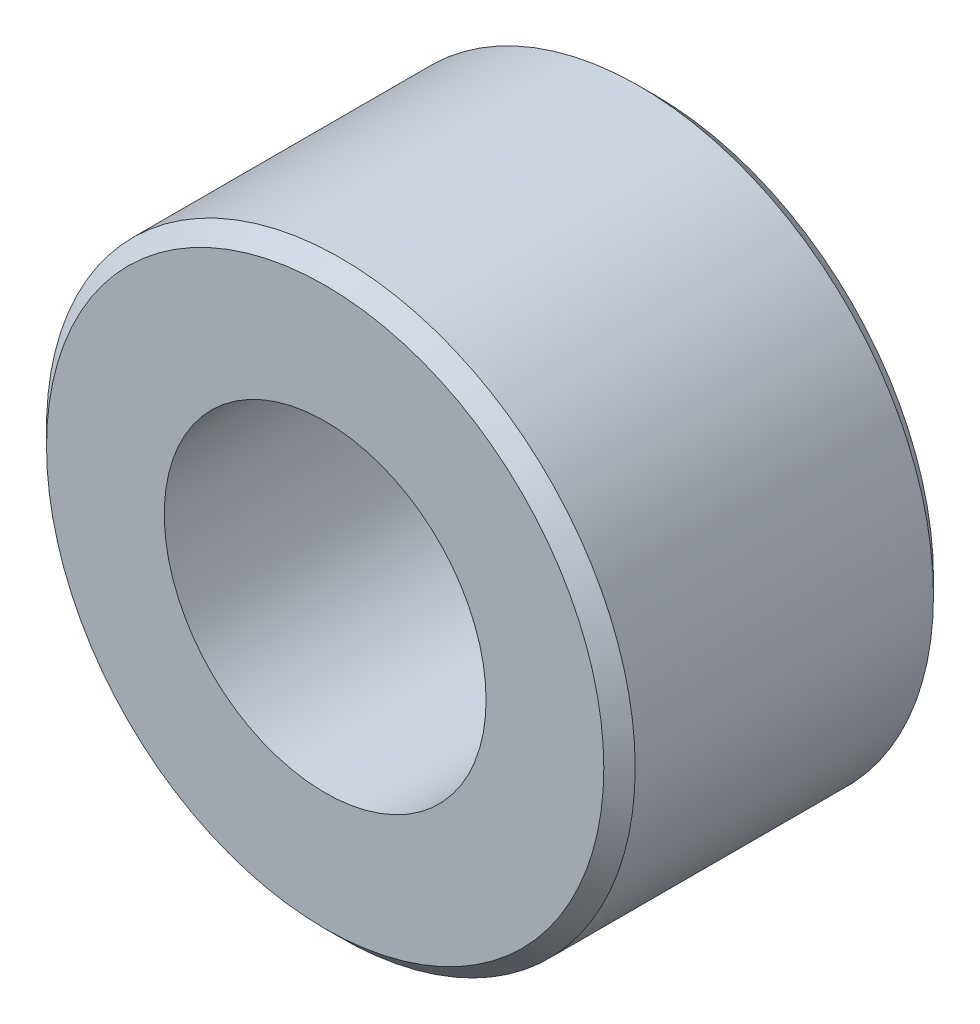
ISO-10303-21;
HEADER;
FILE_DESCRIPTION(('STEP AP214'),'2;1');
FILE_NAME('part.step','',(''),(''),'','','');
FILE_SCHEMA(('AUTOMOTIVE_DESIGN { 1 0 10303 214 1 1 1 1 }'));
ENDSEC;
DATA;
#1=APPLICATION_CONTEXT('core data for automotive mechanical design processes');
#2=APPLICATION_PROTOCOL_DEFINITION('international standard','automotive_design',2000,#1);
#3=PRODUCT_CONTEXT('',#1,'mechanical');
#4=PRODUCT('Part','Part','',(#3));
#5=PRODUCT_RELATED_PRODUCT_CATEGORY('part','',(#4));
#6=PRODUCT_DEFINITION_FORMATION('','',#4);
#7=PRODUCT_DEFINITION_CONTEXT('part definition',#1,'design');
#8=PRODUCT_DEFINITION('design','',#6,#7);
#9=PRODUCT_DEFINITION_SHAPE('','',#8);
#10=(LENGTH_UNIT() NAMED_UNIT(*) SI_UNIT(.MILLI.,.METRE.));
#11=(NAMED_UNIT(*) PLANE_ANGLE_UNIT() SI_UNIT($,.RADIAN.));
#12=(NAMED_UNIT(*) SI_UNIT($,.STERADIAN.) SOLID_ANGLE_UNIT());
#13=UNCERTAINTY_MEASURE_WITH_UNIT(LENGTH_MEASURE(1.E-05),#10,'distance_accuracy_value','');
#14=(GEOMETRIC_REPRESENTATION_CONTEXT(3) GLOBAL_UNCERTAINTY_ASSIGNED_CONTEXT((#13)) GLOBAL_UNIT_ASSIGNED_CONTEXT((#10,
#11,#12)) REPRESENTATION_CONTEXT('',''));
#15=CARTESIAN_POINT('',(0.,0.,0.));
#16=DIRECTION('',(0.,0.,1.));
#17=DIRECTION('',(1.,0.,0.));
#18=AXIS2_PLACEMENT_3D('',#15,#16,#17);
#19=CARTESIAN_POINT('',(0.,0.,4.2));
#20=DIRECTION('',(0.,0.,1.));
#21=DIRECTION('',(1.,0.,0.));
#22=AXIS2_PLACEMENT_3D('',#19,#20,#21);
#23=PLANE('',#22);
#24=CARTESIAN_POINT('',(0.,0.,4.2));
#25=DIRECTION('',(0.,0.,1.));
#26=DIRECTION('',(1.,0.,0.));
#27=AXIS2_PLACEMENT_3D('',#24,#25,#26);
#28=CIRCLE('',#27,7.1);
#29=CARTESIAN_POINT('',(7.1,0.,4.2));
#30=VERTEX_POINT('',#29);
#31=EDGE_CURVE('E10',#30,#30,#28,.T.);
#32=ORIENTED_EDGE('',*,*,#31,.T.);
#33=EDGE_LOOP('',(#32));
#34=FACE_BOUND('',#33,.T.);
#35=CARTESIAN_POINT('',(0.,0.,4.2));
#36=DIRECTION('',(0.,0.,1.));
#37=DIRECTION('',(1.,0.,0.));
#38=AXIS2_PLACEMENT_3D('',#35,#36,#37);
#39=CIRCLE('',#38,4.1);
#40=CARTESIAN_POINT('',(4.1,0.,4.2));
#41=VERTEX_POINT('',#40);
#42=EDGE_CURVE('E68',#41,#41,#39,.T.);
#43=ORIENTED_EDGE('',*,*,#42,.F.);
#44=EDGE_LOOP('',(#43));
#45=FACE_BOUND('',#44,.T.);
#46=ADVANCED_FACE('F42',(#34,#45),#23,.T.);
#47=CARTESIAN_POINT('',(0.,0.,-4.2));
#48=DIRECTION('',(0.,0.,1.));
#49=DIRECTION('',(1.,0.,0.));
#50=AXIS2_PLACEMENT_3D('',#47,#48,#49);
#51=PLANE('',#50);
#52=CARTESIAN_POINT('',(0.,0.,-4.2));
#53=DIRECTION('',(0.,0.,1.));
#54=DIRECTION('',(1.,0.,0.));
#55=AXIS2_PLACEMENT_3D('',#52,#53,#54);
#56=CIRCLE('',#55,7.1);
#57=CARTESIAN_POINT('',(7.1,0.,-4.2));
#58=VERTEX_POINT('',#57);
#59=EDGE_CURVE('E51',#58,#58,#56,.F.);
#60=ORIENTED_EDGE('',*,*,#59,.T.);
#61=EDGE_LOOP('',(#60));
#62=FACE_BOUND('',#61,.T.);
#63=CARTESIAN_POINT('',(0.,0.,-4.2));
#64=DIRECTION('',(0.,0.,1.));
#65=DIRECTION('',(1.,0.,0.));
#66=AXIS2_PLACEMENT_3D('',#63,#64,#65);
#67=CIRCLE('',#66,4.1);
#68=CARTESIAN_POINT('',(4.1,0.,-4.2));
#69=VERTEX_POINT('',#68);
#70=EDGE_CURVE('E69',#69,#69,#67,.T.);
#71=ORIENTED_EDGE('',*,*,#70,.T.);
#72=EDGE_LOOP('',(#71));
#73=FACE_BOUND('',#72,.T.);
#74=ADVANCED_FACE('F80',(#62,#73),#51,.F.);
#75=CARTESIAN_POINT('',(0.,0.,4.2));
#76=DIRECTION('',(0.,0.,-1.));
#77=DIRECTION('',(-1.,0.,0.));
#78=AXIS2_PLACEMENT_3D('',#75,#76,#77);
#79=CYLINDRICAL_SURFACE('',#78,7.5);
#80=CARTESIAN_POINT('',(0.,0.,-3.8));
#81=DIRECTION('',(0.,0.,1.));
#82=DIRECTION('',(1.,0.,0.));
#83=AXIS2_PLACEMENT_3D('',#80,#81,#82);
#84=CIRCLE('',#83,7.5);
#85=CARTESIAN_POINT('',(7.5,0.,-3.8));
#86=VERTEX_POINT('',#85);
#87=EDGE_CURVE('E56',#86,#86,#84,.T.);
#88=ORIENTED_EDGE('',*,*,#87,.T.);
#89=EDGE_LOOP('',(#88));
#90=FACE_BOUND('',#89,.T.);
#91=CARTESIAN_POINT('',(0.,0.,3.8));
#92=DIRECTION('',(0.,0.,1.));
#93=DIRECTION('',(1.,0.,0.));
#94=AXIS2_PLACEMENT_3D('',#91,#92,#93);
#95=CIRCLE('',#94,7.5);
#96=CARTESIAN_POINT('',(7.5,0.,3.8));
#97=VERTEX_POINT('',#96);
#98=EDGE_CURVE('E62',#97,#97,#95,.F.);
#99=ORIENTED_EDGE('',*,*,#98,.T.);
#100=EDGE_LOOP('',(#99));
#101=FACE_BOUND('',#100,.T.);
#102=ADVANCED_FACE('F85',(#90,#101),#79,.T.);
#103=CARTESIAN_POINT('',(0.,0.,4.2));
#104=DIRECTION('',(0.,0.,-1.));
#105=DIRECTION('',(-1.,0.,0.));
#106=AXIS2_PLACEMENT_3D('',#103,#104,#105);
#107=CYLINDRICAL_SURFACE('',#106,4.1);
#108=ORIENTED_EDGE('',*,*,#42,.T.);
#109=EDGE_LOOP('',(#108));
#110=FACE_BOUND('',#109,.T.);
#111=ORIENTED_EDGE('',*,*,#70,.F.);
#112=EDGE_LOOP('',(#111));
#113=FACE_BOUND('',#112,.T.);
#114=ADVANCED_FACE('F76',(#110,#113),#107,.F.);
#115=CARTESIAN_POINT('',(0.,0.,-3.8));
#116=DIRECTION('',(0.,0.,1.));
#117=DIRECTION('',(1.,0.,0.));
#118=AXIS2_PLACEMENT_3D('',#115,#116,#117);
#119=CONICAL_SURFACE('',#118,7.5,0.78539816339745);
#120=CARTESIAN_POINT('',(7.1,0.,-4.2));
#121=CARTESIAN_POINT('',(7.10416666666667,0.,-4.19583333333333));
#122=CARTESIAN_POINT('',(7.10833333333333,0.,-4.19166666666667));
#123=CARTESIAN_POINT('',(7.11666666666667,0.,-4.18333333333333));
#124=CARTESIAN_POINT('',(7.12083333333333,0.,-4.17916666666667));
#125=CARTESIAN_POINT('',(7.12916666666666,0.,-4.17083333333333));
#126=CARTESIAN_POINT('',(7.13333333333333,0.,-4.16666666666667));
#127=CARTESIAN_POINT('',(7.14166666666666,0.,-4.15833333333333));
#128=CARTESIAN_POINT('',(7.14583333333333,0.,-4.15416666666667));
#129=CARTESIAN_POINT('',(7.15416666666667,0.,-4.14583333333333));
#130=CARTESIAN_POINT('',(7.15833333333333,0.,-4.14166666666667));
#131=CARTESIAN_POINT('',(7.16666666666667,0.,-4.13333333333333));
#132=CARTESIAN_POINT('',(7.17083333333333,0.,-4.12916666666667));
#133=CARTESIAN_POINT('',(7.17916666666666,0.,-4.12083333333333));
#134=CARTESIAN_POINT('',(7.18333333333333,0.,-4.11666666666667));
#135=CARTESIAN_POINT('',(7.19166666666667,0.,-4.10833333333334));
#136=CARTESIAN_POINT('',(7.19583333333333,0.,-4.10416666666667));
#137=CARTESIAN_POINT('',(7.20416666666666,0.,-4.09583333333333));
#138=CARTESIAN_POINT('',(7.20833333333333,0.,-4.09166666666667));
#139=CARTESIAN_POINT('',(7.21666666666667,0.,-4.08333333333333));
#140=CARTESIAN_POINT('',(7.22083333333333,0.,-4.07916666666667));
#141=CARTESIAN_POINT('',(7.22916666666667,0.,-4.07083333333333));
#142=CARTESIAN_POINT('',(7.23333333333333,0.,-4.06666666666667));
#143=CARTESIAN_POINT('',(7.24166666666666,0.,-4.05833333333333));
#144=CARTESIAN_POINT('',(7.24583333333333,0.,-4.05416666666667));
#145=CARTESIAN_POINT('',(7.25416666666667,0.,-4.04583333333333));
#146=CARTESIAN_POINT('',(7.25833333333333,0.,-4.04166666666667));
#147=CARTESIAN_POINT('',(7.26666666666666,0.,-4.03333333333333));
#148=CARTESIAN_POINT('',(7.27083333333333,0.,-4.02916666666667));
#149=CARTESIAN_POINT('',(7.27916666666667,0.,-4.02083333333333));
#150=CARTESIAN_POINT('',(7.28333333333333,0.,-4.01666666666667));
#151=CARTESIAN_POINT('',(7.29166666666667,0.,-4.00833333333333));
#152=CARTESIAN_POINT('',(7.29583333333333,0.,-4.00416666666667));
#153=CARTESIAN_POINT('',(7.30416666666667,0.,-3.99583333333333));
#154=CARTESIAN_POINT('',(7.30833333333333,0.,-3.99166666666667));
#155=CARTESIAN_POINT('',(7.31666666666667,0.,-3.98333333333333));
#156=CARTESIAN_POINT('',(7.32083333333333,0.,-3.97916666666667));
#157=CARTESIAN_POINT('',(7.32916666666666,0.,-3.97083333333333));
#158=CARTESIAN_POINT('',(7.33333333333333,0.,-3.96666666666667));
#159=CARTESIAN_POINT('',(7.34166666666667,0.,-3.95833333333333));
#160=CARTESIAN_POINT('',(7.34583333333333,0.,-3.95416666666667));
#161=CARTESIAN_POINT('',(7.35416666666667,0.,-3.94583333333334));
#162=CARTESIAN_POINT('',(7.35833333333333,0.,-3.94166666666667));
#163=CARTESIAN_POINT('',(7.36666666666667,0.,-3.93333333333334));
#164=CARTESIAN_POINT('',(7.37083333333333,0.,-3.92916666666667));
#165=CARTESIAN_POINT('',(7.37916666666666,0.,-3.92083333333333));
#166=CARTESIAN_POINT('',(7.38333333333333,0.,-3.91666666666667));
#167=CARTESIAN_POINT('',(7.39166666666667,0.,-3.90833333333333));
#168=CARTESIAN_POINT('',(7.39583333333333,0.,-3.90416666666667));
#169=CARTESIAN_POINT('',(7.40416666666667,0.,-3.89583333333333));
#170=CARTESIAN_POINT('',(7.40833333333333,0.,-3.89166666666667));
#171=CARTESIAN_POINT('',(7.41666666666667,0.,-3.88333333333333));
#172=CARTESIAN_POINT('',(7.42083333333333,0.,-3.87916666666667));
#173=CARTESIAN_POINT('',(7.42916666666667,0.,-3.87083333333333));
#174=CARTESIAN_POINT('',(7.43333333333333,0.,-3.86666666666667));
#175=CARTESIAN_POINT('',(7.44166666666667,0.,-3.85833333333333));
#176=CARTESIAN_POINT('',(7.44583333333333,0.,-3.85416666666667));
#177=CARTESIAN_POINT('',(7.45416666666667,0.,-3.84583333333333));
#178=CARTESIAN_POINT('',(7.45833333333333,0.,-3.84166666666667));
#179=CARTESIAN_POINT('',(7.46666666666667,0.,-3.83333333333333));
#180=CARTESIAN_POINT('',(7.47083333333333,0.,-3.82916666666667));
#181=CARTESIAN_POINT('',(7.47916666666667,0.,-3.82083333333334));
#182=CARTESIAN_POINT('',(7.48333333333333,0.,-3.81666666666667));
#183=CARTESIAN_POINT('',(7.49166666666667,0.,-3.80833333333333));
#184=CARTESIAN_POINT('',(7.49583333333333,0.,-3.80416666666667));
#185=CARTESIAN_POINT('',(7.5,0.,-3.8));
#186=B_SPLINE_CURVE_WITH_KNOTS('',3,(#120,#121,#122,#123,#124,#125,#126,#127,#128,#129,#130,
#131,#132,#133,#134,#135,#136,#137,#138,#139,#140,#141,#142,#143,#144,#145,#146,#147,#148,#149,
#150,#151,#152,#153,#154,#155,#156,#157,#158,#159,#160,#161,#162,#163,#164,#165,#166,#167,#168,
#169,#170,#171,#172,#173,#174,#175,#176,#177,#178,#179,#180,#181,#182,#183,#184,#185),
.UNSPECIFIED.,.F.,.F.,(4,2,2,2,2,2,2,2,2,2,2,2,2,2,2,2,2,2,2,2,2,2,2,2,2,2,2,2,2,2,2,2,4),(0.,
0.0176776695296642,0.0353553390593284,0.0530330085889914,0.0707106781186556,0.0883883476483191,
0.106066017177983,0.123743686707646,0.14142135623731,0.159099025766974,0.176776695296638,
0.194454364826301,0.212132034355965,0.229809703885629,0.247487373415292,0.265165042944956,
0.28284271247462,0.300520382004283,0.318198051533948,0.33587572106361,0.353553390593275,
0.371231060122938,0.388908729652602,0.406586399182266,0.42426406871193,0.441941738241593,
0.459619407771257,0.477297077300921,0.494974746830584,0.512652416360248,0.530330085889912,
0.548007755419575,0.56568542494924),.UNSPECIFIED.);
#187=EDGE_CURVE('BSEAM92',#58,#86,#186,.T.);
#188=ORIENTED_EDGE('',*,*,#59,.F.);
#189=ORIENTED_EDGE('',*,*,#87,.F.);
#190=ORIENTED_EDGE('',*,*,#187,.T.);
#191=ORIENTED_EDGE('',*,*,#187,.F.);
#192=EDGE_LOOP('',(#188,#190,#189,#191));
#193=FACE_BOUND('',#192,.T.);
#194=ADVANCED_FACE('F92',(#193),#119,.T.);
#195=CARTESIAN_POINT('',(0.,0.,4.2));
#196=DIRECTION('',(0.,0.,-1.));
#197=DIRECTION('',(-1.,0.,0.));
#198=AXIS2_PLACEMENT_3D('',#195,#196,#197);
#199=CONICAL_SURFACE('',#198,7.1,0.785398163397446);
#200=ORIENTED_EDGE('',*,*,#98,.F.);
#201=EDGE_LOOP('',(#200));
#202=FACE_BOUND('',#201,.T.);
#203=ORIENTED_EDGE('',*,*,#31,.F.);
#204=EDGE_LOOP('',(#203));
#205=FACE_BOUND('',#204,.T.);
#206=ADVANCED_FACE('F45',(#202,#205),#199,.T.);
#207=CLOSED_SHELL('',(#46,#74,#102,#114,#194,#206));
#208=MANIFOLD_SOLID_BREP('B2',#207);
#209=ADVANCED_BREP_SHAPE_REPRESENTATION('',(#18,#208),#14);
#210=SHAPE_DEFINITION_REPRESENTATION(#9,#209);
ENDSEC;
END-ISO-10303-21;
